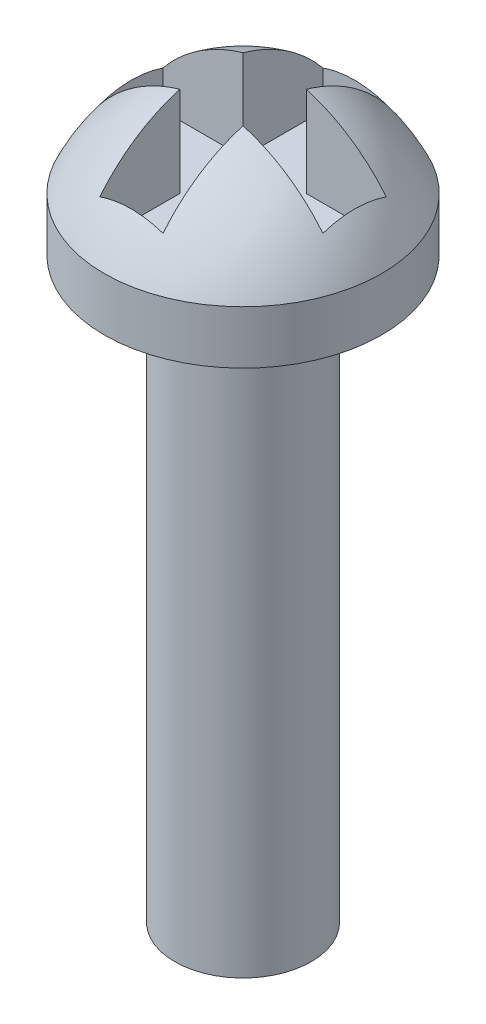
ISO-10303-21;
HEADER;
FILE_DESCRIPTION(('STEP AP214'),'2;1');
FILE_NAME('part.step','',(''),(''),'','','');
FILE_SCHEMA(('AUTOMOTIVE_DESIGN { 1 0 10303 214 1 1 1 1 }'));
ENDSEC;
DATA;
#1=APPLICATION_CONTEXT('core data for automotive mechanical design processes');
#2=APPLICATION_PROTOCOL_DEFINITION('international standard','automotive_design',2000,#1);
#3=PRODUCT_CONTEXT('',#1,'mechanical');
#4=PRODUCT('Part','Part','',(#3));
#5=PRODUCT_RELATED_PRODUCT_CATEGORY('part','',(#4));
#6=PRODUCT_DEFINITION_FORMATION('','',#4);
#7=PRODUCT_DEFINITION_CONTEXT('part definition',#1,'design');
#8=PRODUCT_DEFINITION('design','',#6,#7);
#9=PRODUCT_DEFINITION_SHAPE('','',#8);
#10=(LENGTH_UNIT() NAMED_UNIT(*) SI_UNIT(.MILLI.,.METRE.));
#11=(NAMED_UNIT(*) PLANE_ANGLE_UNIT() SI_UNIT($,.RADIAN.));
#12=(NAMED_UNIT(*) SI_UNIT($,.STERADIAN.) SOLID_ANGLE_UNIT());
#13=UNCERTAINTY_MEASURE_WITH_UNIT(LENGTH_MEASURE(1.E-05),#10,'distance_accuracy_value','');
#14=(GEOMETRIC_REPRESENTATION_CONTEXT(3) GLOBAL_UNCERTAINTY_ASSIGNED_CONTEXT((#13)) GLOBAL_UNIT_ASSIGNED_CONTEXT((#10,
#11,#12)) REPRESENTATION_CONTEXT('',''));
#15=CARTESIAN_POINT('',(0.,0.,0.));
#16=DIRECTION('',(0.,0.,1.));
#17=DIRECTION('',(1.,0.,0.));
#18=AXIS2_PLACEMENT_3D('',#15,#16,#17);
#19=CARTESIAN_POINT('',(1.5,0.,0.));
#20=DIRECTION('',(0.,1.,0.));
#21=DIRECTION('',(0.,0.,1.));
#22=AXIS2_PLACEMENT_3D('',#19,#20,#21);
#23=PLANE('',#22);
#24=CARTESIAN_POINT('',(0.,0.,0.));
#25=DIRECTION('',(0.,1.,0.));
#26=DIRECTION('',(0.,0.,1.));
#27=AXIS2_PLACEMENT_3D('',#24,#25,#26);
#28=CIRCLE('',#27,1.5);
#29=CARTESIAN_POINT('',(0.,0.,1.5));
#30=VERTEX_POINT('',#29);
#31=EDGE_CURVE('E12',#30,#30,#28,.T.);
#32=ORIENTED_EDGE('',*,*,#31,.F.);
#33=EDGE_LOOP('',(#32));
#34=FACE_BOUND('',#33,.T.);
#35=ADVANCED_FACE('F57',(#34),#23,.F.);
#36=CARTESIAN_POINT('',(0.,18.8811759560963,0.));
#37=DIRECTION('',(0.,1.,0.));
#38=DIRECTION('',(0.,0.,1.));
#39=AXIS2_PLACEMENT_3D('',#36,#37,#38);
#40=CYLINDRICAL_SURFACE('',#39,1.5);
#41=CARTESIAN_POINT('',(0.,12.7,0.));
#42=DIRECTION('',(0.,1.,0.));
#43=DIRECTION('',(0.,0.,1.));
#44=AXIS2_PLACEMENT_3D('',#41,#42,#43);
#45=CIRCLE('',#44,1.5);
#46=CARTESIAN_POINT('',(0.,12.7,1.5));
#47=VERTEX_POINT('',#46);
#48=EDGE_CURVE('E64',#47,#47,#45,.T.);
#49=ORIENTED_EDGE('',*,*,#48,.F.);
#50=EDGE_LOOP('',(#49));
#51=FACE_BOUND('',#50,.T.);
#52=ORIENTED_EDGE('',*,*,#31,.T.);
#53=EDGE_LOOP('',(#52));
#54=FACE_BOUND('',#53,.T.);
#55=ADVANCED_FACE('F264',(#51,#54),#40,.T.);
#56=CARTESIAN_POINT('',(3.048,12.7,0.));
#57=DIRECTION('',(0.,1.,0.));
#58=DIRECTION('',(0.,0.,1.));
#59=AXIS2_PLACEMENT_3D('',#56,#57,#58);
#60=PLANE('',#59);
#61=CARTESIAN_POINT('',(0.,12.7,0.));
#62=DIRECTION('',(0.,1.,0.));
#63=DIRECTION('',(0.,0.,1.));
#64=AXIS2_PLACEMENT_3D('',#61,#62,#63);
#65=CIRCLE('',#64,3.048);
#66=CARTESIAN_POINT('',(0.,12.7,3.048));
#67=VERTEX_POINT('',#66);
#68=EDGE_CURVE('E303',#67,#67,#65,.T.);
#69=ORIENTED_EDGE('',*,*,#68,.F.);
#70=EDGE_LOOP('',(#69));
#71=FACE_BOUND('',#70,.T.);
#72=ORIENTED_EDGE('',*,*,#48,.T.);
#73=EDGE_LOOP('',(#72));
#74=FACE_BOUND('',#73,.T.);
#75=ADVANCED_FACE('F269',(#71,#74),#60,.F.);
#76=CARTESIAN_POINT('',(0.,18.8811759560963,0.));
#77=DIRECTION('',(0.,1.,0.));
#78=DIRECTION('',(0.,0.,1.));
#79=AXIS2_PLACEMENT_3D('',#76,#77,#78);
#80=CYLINDRICAL_SURFACE('',#79,3.048);
#81=CARTESIAN_POINT('',(0.,13.8684,0.));
#82=DIRECTION('',(0.,1.,0.));
#83=DIRECTION('',(0.,0.,1.));
#84=AXIS2_PLACEMENT_3D('',#81,#82,#83);
#85=CIRCLE('',#84,3.048);
#86=CARTESIAN_POINT('',(0.,13.8684,3.048));
#87=VERTEX_POINT('',#86);
#88=EDGE_CURVE('E297',#87,#87,#85,.T.);
#89=ORIENTED_EDGE('',*,*,#88,.F.);
#90=EDGE_LOOP('',(#89));
#91=FACE_BOUND('',#90,.T.);
#92=ORIENTED_EDGE('',*,*,#68,.T.);
#93=EDGE_LOOP('',(#92));
#94=FACE_BOUND('',#93,.T.);
#95=ADVANCED_FACE('F276',(#91,#94),#80,.T.);
#96=CARTESIAN_POINT('',(3.048,13.8684,0.));
#97=CARTESIAN_POINT('',(2.15811500529661,15.7488858949441,0.));
#98=CARTESIAN_POINT('',(0.,16.1284431348747,0.));
#99=B_SPLINE_CURVE_WITH_KNOTS('',2,(#96,#97,#98),.UNSPECIFIED.,.F.,.F.,(3,3),(0.,1.),.UNSPECIFIED.);
#100=CARTESIAN_POINT('',(0.,18.8811759560963,0.));
#101=DIRECTION('',(0.,1.,0.));
#102=AXIS1_PLACEMENT('',#100,#101);
#103=SURFACE_OF_REVOLUTION('',#99,#102);
#104=CARTESIAN_POINT('',(2.45218728764485,14.683308631759,0.695108309230363));
#105=CARTESIAN_POINT('',(2.41786052376193,14.7253872350512,0.695108309230363));
#106=CARTESIAN_POINT('',(2.38262641191071,14.7667185759453,0.695108309230363));
#107=CARTESIAN_POINT('',(2.31036374108099,14.8477868572137,0.695108309230363));
#108=CARTESIAN_POINT('',(2.27333504315454,14.8875236736932,0.695108309230363));
#109=CARTESIAN_POINT('',(2.15965442847867,15.0041225825388,0.695108309230363));
#110=CARTESIAN_POINT('',(2.08035469381299,15.0784386948007,0.695108309230364));
#111=CARTESIAN_POINT('',(1.92272166097997,15.2130443459372,0.695108309230364));
#112=CARTESIAN_POINT('',(1.84495130613577,15.2739946613887,0.695108309230363));
#113=CARTESIAN_POINT('',(1.68454791536524,15.3891257344794,0.695108309230363));
#114=CARTESIAN_POINT('',(1.60191298657669,15.4433038310147,0.695108309230363));
#115=CARTESIAN_POINT('',(1.34700620449468,15.5955328741599,0.695108309230363));
#116=CARTESIAN_POINT('',(1.16811839099057,15.6829498663756,0.695108309230363));
#117=CARTESIAN_POINT('',(0.914443673240731,15.7812736383855,0.695108309230363));
#118=CARTESIAN_POINT('',(0.844635576474757,15.8058070574795,0.695108309230363));
#119=CARTESIAN_POINT('',(0.703487643680039,15.8501494624063,0.695108309230363));
#120=CARTESIAN_POINT('',(0.632147575715065,15.8699577272882,0.695108309230363));
#121=CARTESIAN_POINT('',(0.488626573008984,15.9040886720148,0.695108309230363));
#122=CARTESIAN_POINT('',(0.416453692338183,15.9184448990654,0.695108309230363));
#123=CARTESIAN_POINT('',(0.271143140289398,15.9407909402673,0.695108309230363));
#124=CARTESIAN_POINT('',(0.198006156143088,15.9487850638103,0.695108309230364));
#125=CARTESIAN_POINT('',(0.050509216789308,15.9573334259051,0.695108309230364));
#126=CARTESIAN_POINT('',(-0.0238555414520178,15.957809288695,0.695108309230363));
#127=CARTESIAN_POINT('',(-0.17224174189976,15.9510278677989,0.695108309230363));
#128=CARTESIAN_POINT('',(-0.246263028007006,15.9437673592095,0.695108309230363));
#129=CARTESIAN_POINT('',(-0.39371934539479,15.9225599834415,0.695108309230363));
#130=CARTESIAN_POINT('',(-0.467148942209125,15.90857669825,0.695108309230363));
#131=CARTESIAN_POINT('',(-0.612724200966694,15.8750451691733,0.695108309230363));
#132=CARTESIAN_POINT('',(-0.684869456442954,15.8554951956833,0.695108309230364));
#133=CARTESIAN_POINT('',(-0.849941963410784,15.8046713863783,0.695108309230364));
#134=CARTESIAN_POINT('',(-0.942330410714092,15.7716427757686,0.695108309230363));
#135=CARTESIAN_POINT('',(-1.124070512989,15.6979589344262,0.695108309230363));
#136=CARTESIAN_POINT('',(-1.21342005801931,15.6572985275852,0.695108309230364));
#137=CARTESIAN_POINT('',(-1.38829820933419,15.5687863117945,0.695108309230363));
#138=CARTESIAN_POINT('',(-1.47383292154491,15.5209465721158,0.695108309230362));
#139=CARTESIAN_POINT('',(-1.64057279606797,15.4183387642174,0.695108309230364));
#140=CARTESIAN_POINT('',(-1.72178071860754,15.36357519006,0.695108309230367));
#141=CARTESIAN_POINT('',(-1.86120032778571,15.2608208953479,0.695108309230367));
#142=CARTESIAN_POINT('',(-1.92040498954953,15.2141697450536,0.695108309230364));
#143=CARTESIAN_POINT('',(-2.03570132244963,15.1171714554108,0.695108309230362));
#144=CARTESIAN_POINT('',(-2.09179322938465,15.0668245966941,0.695108309230363));
#145=CARTESIAN_POINT('',(-2.20059785351121,14.9627575389312,0.695108309230364));
#146=CARTESIAN_POINT('',(-2.25331523629739,14.9090422099825,0.695108309230364));
#147=CARTESIAN_POINT('',(-2.35533883832368,14.7984639716167,0.695108309230363));
#148=CARTESIAN_POINT('',(-2.40464509816146,14.7416010996747,0.695108309230363));
#149=CARTESIAN_POINT('',(-2.45218728764478,14.6833086317591,0.695108309230363));
#150=B_SPLINE_CURVE_WITH_KNOTS('',3,(#104,#105,#106,#107,#108,#109,#110,#111,#112,#113,#114,
#115,#116,#117,#118,#119,#120,#121,#122,#123,#124,#125,#126,#127,#128,#129,#130,#131,#132,#133,
#134,#135,#136,#137,#138,#139,#140,#141,#142,#143,#144,#145,#146,#147,#148,#149),.UNSPECIFIED.,
.F.,.F.,(4,2,2,2,2,2,2,2,2,2,2,2,2,2,2,2,2,2,2,2,2,2,4),(0.,0.162887365782872,0.325787363522561,
0.651334802267644,0.947397805339321,1.2435767813607,1.83743811303774,2.05932370653175,
2.28124313309363,2.50177403544007,2.72215543301401,2.9448327466095,3.16760291948517,
3.39159369770457,3.61565414734007,3.90962034044839,4.20378663526021,4.49746383108754,
4.79095137875579,5.01693147633827,5.24289443194569,5.4685379060844,5.69417869425192),.UNSPECIFIED.);
#151=CARTESIAN_POINT('',(-0.695108309230364,15.8516865527996,0.695108309230363));
#152=VERTEX_POINT('',#151);
#153=CARTESIAN_POINT('',(-2.45218728764485,14.6833086317591,0.695108309230363));
#154=VERTEX_POINT('',#153);
#155=EDGE_CURVE('E239',#152,#154,#150,.T.);
#156=ORIENTED_EDGE('',*,*,#155,.T.);
#157=CARTESIAN_POINT('',(-2.45218728764481,14.6833086317591,-0.695108309230353));
#158=CARTESIAN_POINT('',(-2.45218728764483,14.7013143410647,-0.643309765145707));
#159=CARTESIAN_POINT('',(-2.45218728764484,14.7173537277317,-0.590824345734146));
#160=CARTESIAN_POINT('',(-2.45218728764485,14.7453668382591,-0.48477111569305));
#161=CARTESIAN_POINT('',(-2.45218728764485,14.757339902842,-0.431203131036202));
#162=CARTESIAN_POINT('',(-2.45218728764485,14.7770902809719,-0.323244721441193));
#163=CARTESIAN_POINT('',(-2.45218728764485,14.7848638217974,-0.268853601961661));
#164=CARTESIAN_POINT('',(-2.45218728764484,14.7961183975468,-0.159645589862251));
#165=CARTESIAN_POINT('',(-2.45218728764484,14.7995998864219,-0.104828742886904));
#166=CARTESIAN_POINT('',(-2.45218728764487,14.8035326540557,0.059890129572541));
#167=CARTESIAN_POINT('',(-2.45218728764498,14.7974634257665,0.17001237939108));
#168=CARTESIAN_POINT('',(-2.45218728764471,14.7681739781714,0.387716872042851));
#169=CARTESIAN_POINT('',(-2.45218728764434,14.7449915926198,0.495304178537056));
#170=CARTESIAN_POINT('',(-2.45218728764479,14.7090937619302,0.616273177101096));
#171=CARTESIAN_POINT('',(-2.45218728764487,14.7041877957881,0.632129179410969));
#172=CARTESIAN_POINT('',(-2.45218728764482,14.6940169455485,0.663712368626811));
#173=CARTESIAN_POINT('',(-2.4521872876447,14.6887523369885,0.679439644252939));
#174=CARTESIAN_POINT('',(-2.45218728764436,14.6833086317592,0.695108309230538));
#175=B_SPLINE_CURVE_WITH_KNOTS('',3,(#157,#158,#159,#160,#161,#162,#163,#164,#165,#166,#167,
#168,#169,#170,#171,#172,#173,#174),.UNSPECIFIED.,.F.,.F.,(4,2,2,2,2,2,2,2,4),(0.,
0.16448136238942,0.328989379615555,0.49364494099215,0.658283085990713,0.987704444519377,
1.31639969148478,1.36619170176598,1.41594588016233),.UNSPECIFIED.);
#176=CARTESIAN_POINT('',(-2.45218728764481,14.6833086317591,-0.695108309230353));
#177=VERTEX_POINT('',#176);
#178=EDGE_CURVE('E186',#177,#154,#175,.T.);
#179=ORIENTED_EDGE('',*,*,#178,.F.);
#180=CARTESIAN_POINT('',(2.45218728764485,14.683308631759,-0.695108309230363));
#181=CARTESIAN_POINT('',(2.41786052376193,14.7253872350512,-0.695108309230363));
#182=CARTESIAN_POINT('',(2.38262641191071,14.7667185759453,-0.695108309230363));
#183=CARTESIAN_POINT('',(2.31036374108099,14.8477868572137,-0.695108309230363));
#184=CARTESIAN_POINT('',(2.27333504315454,14.8875236736932,-0.695108309230363));
#185=CARTESIAN_POINT('',(2.15965442847867,15.0041225825388,-0.695108309230363));
#186=CARTESIAN_POINT('',(2.08035469381299,15.0784386948007,-0.695108309230363));
#187=CARTESIAN_POINT('',(1.92272166097997,15.2130443459372,-0.695108309230363));
#188=CARTESIAN_POINT('',(1.84495130613577,15.2739946613887,-0.695108309230363));
#189=CARTESIAN_POINT('',(1.68454791536524,15.3891257344794,-0.695108309230363));
#190=CARTESIAN_POINT('',(1.60191298657669,15.4433038310147,-0.695108309230363));
#191=CARTESIAN_POINT('',(1.34700620449468,15.5955328741599,-0.695108309230363));
#192=CARTESIAN_POINT('',(1.16811839099058,15.6829498663756,-0.695108309230363));
#193=CARTESIAN_POINT('',(0.914443673240733,15.7812736383855,-0.695108309230363));
#194=CARTESIAN_POINT('',(0.844635576474759,15.8058070574795,-0.695108309230363));
#195=CARTESIAN_POINT('',(0.703487643680042,15.8501494624063,-0.695108309230363));
#196=CARTESIAN_POINT('',(0.632147575715067,15.8699577272882,-0.695108309230363));
#197=CARTESIAN_POINT('',(0.488626573008986,15.9040886720148,-0.695108309230363));
#198=CARTESIAN_POINT('',(0.416453692338184,15.9184448990654,-0.695108309230363));
#199=CARTESIAN_POINT('',(0.271143140289399,15.9407909402673,-0.695108309230363));
#200=CARTESIAN_POINT('',(0.198006156143089,15.9487850638103,-0.695108309230363));
#201=CARTESIAN_POINT('',(0.0505092167893075,15.9573334259051,-0.695108309230363));
#202=CARTESIAN_POINT('',(-0.0238555414520186,15.957809288695,-0.695108309230363));
#203=CARTESIAN_POINT('',(-0.172241741899762,15.9510278677989,-0.695108309230363));
#204=CARTESIAN_POINT('',(-0.246263028007008,15.9437673592095,-0.695108309230363));
#205=CARTESIAN_POINT('',(-0.393719345394793,15.9225599834415,-0.695108309230363));
#206=CARTESIAN_POINT('',(-0.467148942209129,15.90857669825,-0.695108309230363));
#207=CARTESIAN_POINT('',(-0.6127242009667,15.8750451691733,-0.695108309230363));
#208=CARTESIAN_POINT('',(-0.684869456442959,15.8554951956833,-0.695108309230363));
#209=CARTESIAN_POINT('',(-0.849941963410789,15.8046713863783,-0.695108309230363));
#210=CARTESIAN_POINT('',(-0.942330410714097,15.7716427757686,-0.695108309230363));
#211=CARTESIAN_POINT('',(-1.124070512989,15.6979589344262,-0.695108309230364));
#212=CARTESIAN_POINT('',(-1.21342005801931,15.6572985275852,-0.695108309230364));
#213=CARTESIAN_POINT('',(-1.3882982093342,15.5687863117945,-0.695108309230363));
#214=CARTESIAN_POINT('',(-1.47383292154492,15.5209465721158,-0.695108309230362));
#215=CARTESIAN_POINT('',(-1.64057279606797,15.4183387642174,-0.695108309230365));
#216=CARTESIAN_POINT('',(-1.72178071860755,15.36357519006,-0.695108309230368));
#217=CARTESIAN_POINT('',(-1.86120032778571,15.2608208953479,-0.695108309230367));
#218=CARTESIAN_POINT('',(-1.92040498954954,15.2141697450536,-0.695108309230364));
#219=CARTESIAN_POINT('',(-2.03570132244964,15.1171714554108,-0.695108309230362));
#220=CARTESIAN_POINT('',(-2.09179322938465,15.0668245966941,-0.695108309230363));
#221=CARTESIAN_POINT('',(-2.20059785351121,14.9627575389312,-0.695108309230364));
#222=CARTESIAN_POINT('',(-2.2533152362974,14.9090422099825,-0.695108309230363));
#223=CARTESIAN_POINT('',(-2.35533883832368,14.7984639716167,-0.695108309230363));
#224=CARTESIAN_POINT('',(-2.40464509816146,14.7416010996747,-0.695108309230363));
#225=CARTESIAN_POINT('',(-2.45218728764478,14.6833086317591,-0.695108309230364));
#226=B_SPLINE_CURVE_WITH_KNOTS('',3,(#180,#181,#182,#183,#184,#185,#186,#187,#188,#189,#190,
#191,#192,#193,#194,#195,#196,#197,#198,#199,#200,#201,#202,#203,#204,#205,#206,#207,#208,#209,
#210,#211,#212,#213,#214,#215,#216,#217,#218,#219,#220,#221,#222,#223,#224,#225),.UNSPECIFIED.,
.F.,.F.,(4,2,2,2,2,2,2,2,2,2,2,2,2,2,2,2,2,2,2,2,2,2,4),(0.,0.162887365782872,0.325787363522561,
0.651334802267644,0.947397805339321,1.2435767813607,1.83743811303774,2.05932370653174,
2.28124313309363,2.50177403544007,2.72215543301401,2.9448327466095,3.16760291948517,
3.39159369770458,3.61565414734008,3.9096203404484,4.20378663526022,4.49746383108755,
4.7909513787558,5.01693147633828,5.2428944319457,5.4685379060844,5.69417869425192),.UNSPECIFIED.);
#227=CARTESIAN_POINT('',(-0.695108309230363,15.8516865527996,-0.695108309230364));
#228=VERTEX_POINT('',#227);
#229=EDGE_CURVE('E119',#228,#177,#226,.T.);
#230=ORIENTED_EDGE('',*,*,#229,.F.);
#231=CARTESIAN_POINT('',(-0.695108309230364,14.683308631759,-2.45218728764485));
#232=CARTESIAN_POINT('',(-0.695108309230363,14.7253872350512,-2.41786052376193));
#233=CARTESIAN_POINT('',(-0.695108309230363,14.7667185759453,-2.38262641191072));
#234=CARTESIAN_POINT('',(-0.695108309230364,14.8477868572137,-2.31036374108099));
#235=CARTESIAN_POINT('',(-0.695108309230364,14.8875236736932,-2.27333504315455));
#236=CARTESIAN_POINT('',(-0.695108309230363,15.0041225825388,-2.15965442847868));
#237=CARTESIAN_POINT('',(-0.695108309230362,15.0784386948007,-2.08035469381299));
#238=CARTESIAN_POINT('',(-0.695108309230362,15.2130443459372,-1.92272166097997));
#239=CARTESIAN_POINT('',(-0.695108309230363,15.2739946613887,-1.84495130613578));
#240=CARTESIAN_POINT('',(-0.695108309230364,15.3891257344794,-1.68454791536525));
#241=CARTESIAN_POINT('',(-0.695108309230364,15.4433038310146,-1.6019129865767));
#242=CARTESIAN_POINT('',(-0.695108309230363,15.5955328741598,-1.3470062044947));
#243=CARTESIAN_POINT('',(-0.695108309230364,15.6829498663756,-1.16811839099059));
#244=CARTESIAN_POINT('',(-0.695108309230364,15.7812736383855,-0.914443673240746));
#245=CARTESIAN_POINT('',(-0.695108309230364,15.8058070574795,-0.844635576474772));
#246=CARTESIAN_POINT('',(-0.695108309230364,15.8501494624063,-0.703487643680053));
#247=CARTESIAN_POINT('',(-0.695108309230364,15.8699577272882,-0.632147575715078));
#248=CARTESIAN_POINT('',(-0.695108309230364,15.9040886720148,-0.488626573008995));
#249=CARTESIAN_POINT('',(-0.695108309230364,15.9184448990654,-0.416453692338194));
#250=CARTESIAN_POINT('',(-0.695108309230363,15.9407909402673,-0.271143140289407));
#251=CARTESIAN_POINT('',(-0.695108309230363,15.9487850638103,-0.198006156143096));
#252=CARTESIAN_POINT('',(-0.695108309230363,15.9573334259051,-0.0505092167893136));
#253=CARTESIAN_POINT('',(-0.695108309230364,15.957809288695,0.023855541452013));
#254=CARTESIAN_POINT('',(-0.695108309230364,15.9510278677989,0.172241741899757));
#255=CARTESIAN_POINT('',(-0.695108309230364,15.9437673592095,0.246263028007005));
#256=CARTESIAN_POINT('',(-0.695108309230364,15.9225599834415,0.393719345394791));
#257=CARTESIAN_POINT('',(-0.695108309230364,15.90857669825,0.467148942209127));
#258=CARTESIAN_POINT('',(-0.695108309230363,15.8750451691733,0.612724200966699));
#259=CARTESIAN_POINT('',(-0.695108309230363,15.8554951956833,0.684869456442959));
#260=CARTESIAN_POINT('',(-0.695108309230363,15.8046713863783,0.84994196341079));
#261=CARTESIAN_POINT('',(-0.695108309230363,15.7716427757686,0.942330410714098));
#262=CARTESIAN_POINT('',(-0.695108309230364,15.6979589344262,1.12407051298901));
#263=CARTESIAN_POINT('',(-0.695108309230364,15.6572985275852,1.21342005801931));
#264=CARTESIAN_POINT('',(-0.695108309230363,15.5687863117945,1.3882982093342));
#265=CARTESIAN_POINT('',(-0.695108309230362,15.5209465721158,1.47383292154492));
#266=CARTESIAN_POINT('',(-0.695108309230365,15.4183387642174,1.64057279606798));
#267=CARTESIAN_POINT('',(-0.695108309230369,15.36357519006,1.72178071860755));
#268=CARTESIAN_POINT('',(-0.695108309230368,15.2608208953478,1.86120032778572));
#269=CARTESIAN_POINT('',(-0.695108309230365,15.2141697450536,1.92040498954956));
#270=CARTESIAN_POINT('',(-0.695108309230362,15.1171714554108,2.03570132244966));
#271=CARTESIAN_POINT('',(-0.695108309230363,15.0668245966941,2.09179322938468));
#272=CARTESIAN_POINT('',(-0.695108309230364,14.9627575389312,2.20059785351125));
#273=CARTESIAN_POINT('',(-0.695108309230364,14.9090422099825,2.25331523629744));
#274=CARTESIAN_POINT('',(-0.695108309230364,14.7984639716166,2.35533883832374));
#275=CARTESIAN_POINT('',(-0.695108309230364,14.7416010996747,2.40464509816152));
#276=CARTESIAN_POINT('',(-0.695108309230365,14.683308631759,2.45218728764485));
#277=B_SPLINE_CURVE_WITH_KNOTS('',3,(#231,#232,#233,#234,#235,#236,#237,#238,#239,#240,#241,
#242,#243,#244,#245,#246,#247,#248,#249,#250,#251,#252,#253,#254,#255,#256,#257,#258,#259,#260,
#261,#262,#263,#264,#265,#266,#267,#268,#269,#270,#271,#272,#273,#274,#275,#276),.UNSPECIFIED.,
.F.,.F.,(4,2,2,2,2,2,2,2,2,2,2,2,2,2,2,2,2,2,2,2,2,2,4),(0.,0.162887365782873,0.32578736352256,
0.651334802267643,0.947397805339317,1.24357678136069,1.83743811303773,2.05932370653174,
2.28124313309362,2.50177403544007,2.72215543301401,2.9448327466095,3.16760291948518,
3.39159369770458,3.61565414734008,3.9096203404484,4.20378663526022,4.49746383108756,
4.79095137875581,5.01693147633831,5.24289443194576,5.46853790608448,5.69417869425202),.UNSPECIFIED.);
#278=CARTESIAN_POINT('',(-0.695108309230364,14.683308631759,-2.45218728764485));
#279=VERTEX_POINT('',#278);
#280=EDGE_CURVE('E240',#279,#228,#277,.T.);
#281=ORIENTED_EDGE('',*,*,#280,.F.);
#282=CARTESIAN_POINT('',(0.695108309230364,14.683308631759,-2.45218728764485));
#283=CARTESIAN_POINT('',(0.643309765145734,14.7013143410646,-2.45218728764485));
#284=CARTESIAN_POINT('',(0.59082434573418,14.7173537277316,-2.45218728764485));
#285=CARTESIAN_POINT('',(0.484771115693088,14.7453668382591,-2.45218728764485));
#286=CARTESIAN_POINT('',(0.431203131036239,14.757339902842,-2.45218728764485));
#287=CARTESIAN_POINT('',(0.32324472144123,14.7770902809719,-2.45218728764485));
#288=CARTESIAN_POINT('',(0.268853601961699,14.7848638217974,-2.45218728764485));
#289=CARTESIAN_POINT('',(0.159645589862292,14.7961183975468,-2.45218728764484));
#290=CARTESIAN_POINT('',(0.104828742886947,14.7995998864219,-2.45218728764483));
#291=CARTESIAN_POINT('',(-0.0598901295724979,14.8035326540557,-2.45218728764487));
#292=CARTESIAN_POINT('',(-0.170012379391038,14.7974634257665,-2.45218728764498));
#293=CARTESIAN_POINT('',(-0.387716872042809,14.7681739781714,-2.45218728764471));
#294=CARTESIAN_POINT('',(-0.495304178537014,14.7449915926198,-2.45218728764434));
#295=CARTESIAN_POINT('',(-0.616273177101072,14.7090937619302,-2.45218728764479));
#296=CARTESIAN_POINT('',(-0.632129179410959,14.7041877957881,-2.45218728764487));
#297=CARTESIAN_POINT('',(-0.663712368626827,14.6940169455485,-2.45218728764482));
#298=CARTESIAN_POINT('',(-0.679439644252967,14.6887523369885,-2.4521872876447));
#299=CARTESIAN_POINT('',(-0.695108309230578,14.6833086317592,-2.45218728764436));
#300=B_SPLINE_CURVE_WITH_KNOTS('',3,(#282,#283,#284,#285,#286,#287,#288,#289,#290,#291,#292,
#293,#294,#295,#296,#297,#298,#299),.UNSPECIFIED.,.F.,.F.,(4,2,2,2,2,2,2,2,4),(0.,
0.164481362389426,0.328989379615563,0.493644940992153,0.658283085990713,0.987704444519377,
1.31639969148478,1.36619170176602,1.41594588016242),.UNSPECIFIED.);
#301=CARTESIAN_POINT('',(0.695108309230364,14.683308631759,-2.45218728764485));
#302=VERTEX_POINT('',#301);
#303=EDGE_CURVE('E210',#302,#279,#300,.T.);
#304=ORIENTED_EDGE('',*,*,#303,.F.);
#305=CARTESIAN_POINT('',(0.695108309230364,14.683308631759,-2.45218728764485));
#306=CARTESIAN_POINT('',(0.695108309230364,14.7253872350512,-2.41786052376193));
#307=CARTESIAN_POINT('',(0.695108309230364,14.7667185759453,-2.38262641191072));
#308=CARTESIAN_POINT('',(0.695108309230364,14.8477868572137,-2.31036374108099));
#309=CARTESIAN_POINT('',(0.695108309230364,14.8875236736932,-2.27333504315455));
#310=CARTESIAN_POINT('',(0.695108309230364,15.0041225825388,-2.15965442847868));
#311=CARTESIAN_POINT('',(0.695108309230364,15.0784386948007,-2.08035469381299));
#312=CARTESIAN_POINT('',(0.695108309230364,15.2130443459372,-1.92272166097998));
#313=CARTESIAN_POINT('',(0.695108309230364,15.2739946613887,-1.84495130613578));
#314=CARTESIAN_POINT('',(0.695108309230364,15.3891257344794,-1.68454791536525));
#315=CARTESIAN_POINT('',(0.695108309230364,15.4433038310146,-1.6019129865767));
#316=CARTESIAN_POINT('',(0.695108309230364,15.5955328741598,-1.34700620449469));
#317=CARTESIAN_POINT('',(0.695108309230364,15.6829498663756,-1.16811839099058));
#318=CARTESIAN_POINT('',(0.695108309230364,15.7812736383855,-0.914443673240738));
#319=CARTESIAN_POINT('',(0.695108309230364,15.8058070574795,-0.844635576474765));
#320=CARTESIAN_POINT('',(0.695108309230364,15.8501494624063,-0.703487643680047));
#321=CARTESIAN_POINT('',(0.695108309230364,15.8699577272882,-0.632147575715071));
#322=CARTESIAN_POINT('',(0.695108309230364,15.9040886720148,-0.48862657300899));
#323=CARTESIAN_POINT('',(0.695108309230364,15.9184448990654,-0.416453692338188));
#324=CARTESIAN_POINT('',(0.695108309230364,15.9407909402673,-0.271143140289402));
#325=CARTESIAN_POINT('',(0.695108309230363,15.9487850638103,-0.198006156143091));
#326=CARTESIAN_POINT('',(0.695108309230363,15.9573334259052,-0.0505092167893096));
#327=CARTESIAN_POINT('',(0.695108309230364,15.957809288695,0.0238555414520166));
#328=CARTESIAN_POINT('',(0.695108309230364,15.9510278677989,0.17224174189976));
#329=CARTESIAN_POINT('',(0.695108309230364,15.9437673592095,0.246263028007007));
#330=CARTESIAN_POINT('',(0.695108309230364,15.9225599834415,0.393719345394792));
#331=CARTESIAN_POINT('',(0.695108309230364,15.90857669825,0.467148942209128));
#332=CARTESIAN_POINT('',(0.695108309230364,15.8750451691733,0.612724200966699));
#333=CARTESIAN_POINT('',(0.695108309230363,15.8554951956833,0.684869456442959));
#334=CARTESIAN_POINT('',(0.695108309230363,15.8046713863783,0.849941963410789));
#335=CARTESIAN_POINT('',(0.695108309230363,15.7716427757686,0.942330410714097));
#336=CARTESIAN_POINT('',(0.695108309230364,15.6979589344262,1.124070512989));
#337=CARTESIAN_POINT('',(0.695108309230364,15.6572985275852,1.21342005801931));
#338=CARTESIAN_POINT('',(0.695108309230363,15.5687863117945,1.3882982093342));
#339=CARTESIAN_POINT('',(0.695108309230362,15.5209465721158,1.47383292154492));
#340=CARTESIAN_POINT('',(0.695108309230365,15.4183387642174,1.64057279606797));
#341=CARTESIAN_POINT('',(0.695108309230369,15.36357519006,1.72178071860755));
#342=CARTESIAN_POINT('',(0.695108309230368,15.2608208953478,1.86120032778572));
#343=CARTESIAN_POINT('',(0.695108309230365,15.2141697450536,1.92040498954955));
#344=CARTESIAN_POINT('',(0.695108309230363,15.1171714554108,2.03570132244966));
#345=CARTESIAN_POINT('',(0.695108309230363,15.0668245966941,2.09179322938468));
#346=CARTESIAN_POINT('',(0.695108309230364,14.9627575389312,2.20059785351125));
#347=CARTESIAN_POINT('',(0.695108309230364,14.9090422099825,2.25331523629744));
#348=CARTESIAN_POINT('',(0.695108309230363,14.7984639716166,2.35533883832374));
#349=CARTESIAN_POINT('',(0.695108309230363,14.7416010996747,2.40464509816152));
#350=CARTESIAN_POINT('',(0.695108309230362,14.683308631759,2.45218728764485));
#351=B_SPLINE_CURVE_WITH_KNOTS('',3,(#305,#306,#307,#308,#309,#310,#311,#312,#313,#314,#315,
#316,#317,#318,#319,#320,#321,#322,#323,#324,#325,#326,#327,#328,#329,#330,#331,#332,#333,#334,
#335,#336,#337,#338,#339,#340,#341,#342,#343,#344,#345,#346,#347,#348,#349,#350),.UNSPECIFIED.,
.F.,.F.,(4,2,2,2,2,2,2,2,2,2,2,2,2,2,2,2,2,2,2,2,2,2,4),(0.,0.162887365782872,0.325787363522559,
0.651334802267642,0.947397805339318,1.2435767813607,1.83743811303774,2.05932370653174,
2.28124313309363,2.50177403544008,2.72215543301401,2.94483274660951,3.16760291948518,
3.39159369770458,3.61565414734008,3.9096203404484,4.20378663526022,4.49746383108755,
4.79095137875581,5.01693147633831,5.24289443194576,5.46853790608448,5.69417869425202),.UNSPECIFIED.);
#352=CARTESIAN_POINT('',(0.695108309230302,15.8516865527996,-0.695108309230353));
#353=VERTEX_POINT('',#352);
#354=EDGE_CURVE('E339',#302,#353,#351,.T.);
#355=ORIENTED_EDGE('',*,*,#354,.T.);
#356=CARTESIAN_POINT('',(2.45218728764485,14.683308631759,-0.695108309230363));
#357=VERTEX_POINT('',#356);
#358=EDGE_CURVE('E163',#357,#353,#226,.T.);
#359=ORIENTED_EDGE('',*,*,#358,.F.);
#360=CARTESIAN_POINT('',(2.45218728764485,14.683308631759,-0.695108309230363));
#361=CARTESIAN_POINT('',(2.45218728764485,14.7013143410646,-0.643309765145732));
#362=CARTESIAN_POINT('',(2.45218728764485,14.7173537277316,-0.590824345734177));
#363=CARTESIAN_POINT('',(2.45218728764485,14.7453668382591,-0.484771115693085));
#364=CARTESIAN_POINT('',(2.45218728764485,14.757339902842,-0.431203131036236));
#365=CARTESIAN_POINT('',(2.45218728764485,14.7770902809719,-0.323244721441227));
#366=CARTESIAN_POINT('',(2.45218728764485,14.7848638217974,-0.268853601961696));
#367=CARTESIAN_POINT('',(2.45218728764484,14.7961183975468,-0.159645589862289));
#368=CARTESIAN_POINT('',(2.45218728764483,14.7995998864219,-0.104828742886943));
#369=CARTESIAN_POINT('',(2.45218728764487,14.8035326540557,0.0598901295725024));
#370=CARTESIAN_POINT('',(2.45218728764498,14.7974634257665,0.170012379391042));
#371=CARTESIAN_POINT('',(2.45218728764471,14.7681739781714,0.387716872042814));
#372=CARTESIAN_POINT('',(2.45218728764433,14.7449915926198,0.495304178537019));
#373=CARTESIAN_POINT('',(2.45218728764479,14.7090937619302,0.616273177101075));
#374=CARTESIAN_POINT('',(2.45218728764487,14.7041877957881,0.63212917941096));
#375=CARTESIAN_POINT('',(2.45218728764482,14.6940169455485,0.663712368626826));
#376=CARTESIAN_POINT('',(2.4521872876447,14.6887523369885,0.679439644252965));
#377=CARTESIAN_POINT('',(2.45218728764436,14.6833086317592,0.695108309230575));
#378=B_SPLINE_CURVE_WITH_KNOTS('',3,(#360,#361,#362,#363,#364,#365,#366,#367,#368,#369,#370,
#371,#372,#373,#374,#375,#376,#377),.UNSPECIFIED.,.F.,.F.,(4,2,2,2,2,2,2,2,4),(0.,
0.164481362389426,0.328989379615562,0.493644940992152,0.658283085990714,0.987704444519378,
1.31639969148478,1.36619170176602,1.41594588016241),.UNSPECIFIED.);
#379=CARTESIAN_POINT('',(2.45218728764485,14.683308631759,0.695108309230363));
#380=VERTEX_POINT('',#379);
#381=EDGE_CURVE('E230',#357,#380,#378,.T.);
#382=ORIENTED_EDGE('',*,*,#381,.T.);
#383=CARTESIAN_POINT('',(0.695108309230302,15.8516865527996,0.695108309230353));
#384=VERTEX_POINT('',#383);
#385=EDGE_CURVE('E241',#380,#384,#150,.T.);
#386=ORIENTED_EDGE('',*,*,#385,.T.);
#387=CARTESIAN_POINT('',(0.695108309230363,14.683308631759,2.45218728764485));
#388=VERTEX_POINT('',#387);
#389=EDGE_CURVE('E344',#384,#388,#351,.T.);
#390=ORIENTED_EDGE('',*,*,#389,.T.);
#391=CARTESIAN_POINT('',(0.695108309230363,14.683308631759,2.45218728764485));
#392=CARTESIAN_POINT('',(0.643309765145735,14.7013143410646,2.45218728764485));
#393=CARTESIAN_POINT('',(0.590824345734181,14.7173537277317,2.45218728764485));
#394=CARTESIAN_POINT('',(0.484771115693088,14.7453668382591,2.45218728764485));
#395=CARTESIAN_POINT('',(0.431203131036238,14.757339902842,2.45218728764485));
#396=CARTESIAN_POINT('',(0.323244721441229,14.7770902809719,2.45218728764485));
#397=CARTESIAN_POINT('',(0.268853601961699,14.7848638217974,2.45218728764485));
#398=CARTESIAN_POINT('',(0.159645589862292,14.7961183975468,2.45218728764484));
#399=CARTESIAN_POINT('',(0.104828742886947,14.7995998864219,2.45218728764484));
#400=CARTESIAN_POINT('',(-0.0598901295724984,14.8035326540557,2.45218728764487));
#401=CARTESIAN_POINT('',(-0.170012379391038,14.7974634257665,2.45218728764498));
#402=CARTESIAN_POINT('',(-0.38771687204281,14.7681739781714,2.45218728764471));
#403=CARTESIAN_POINT('',(-0.495304178537016,14.7449915926198,2.45218728764434));
#404=CARTESIAN_POINT('',(-0.616273177101071,14.7090937619302,2.45218728764479));
#405=CARTESIAN_POINT('',(-0.632129179410958,14.7041877957881,2.45218728764487));
#406=CARTESIAN_POINT('',(-0.663712368626826,14.6940169455485,2.45218728764482));
#407=CARTESIAN_POINT('',(-0.679439644252966,14.6887523369885,2.4521872876447));
#408=CARTESIAN_POINT('',(-0.695108309230578,14.6833086317592,2.45218728764436));
#409=B_SPLINE_CURVE_WITH_KNOTS('',3,(#391,#392,#393,#394,#395,#396,#397,#398,#399,#400,#401,
#402,#403,#404,#405,#406,#407,#408),.UNSPECIFIED.,.F.,.F.,(4,2,2,2,2,2,2,2,4),(0.,
0.164481362389425,0.328989379615562,0.493644940992151,0.658283085990712,0.987704444519376,
1.31639969148478,1.36619170176602,1.41594588016242),.UNSPECIFIED.);
#410=CARTESIAN_POINT('',(-0.695108309230364,14.683308631759,2.45218728764485));
#411=VERTEX_POINT('',#410);
#412=EDGE_CURVE('E71',#388,#411,#409,.T.);
#413=ORIENTED_EDGE('',*,*,#412,.T.);
#414=EDGE_CURVE('E325',#152,#411,#277,.T.);
#415=ORIENTED_EDGE('',*,*,#414,.F.);
#416=EDGE_LOOP('',(#156,#179,#230,#281,#304,#355,#359,#382,#386,#390,#413,#415));
#417=FACE_BOUND('',#416,.T.);
#418=ORIENTED_EDGE('',*,*,#88,.T.);
#419=EDGE_LOOP('',(#418));
#420=FACE_BOUND('',#419,.T.);
#421=ADVANCED_FACE('F283',(#417,#420),#103,.T.);
#422=CARTESIAN_POINT('',(-2.45218728764485,16.1294431348747,0.695108309230363));
#423=DIRECTION('',(-1.,0.,0.));
#424=DIRECTION('',(0.,0.,1.));
#425=AXIS2_PLACEMENT_3D('',#422,#423,#424);
#426=PLANE('',#425);
#427=ORIENTED_EDGE('',*,*,#178,.T.);
#428=DIRECTION('',(0.,-1.,0.));
#429=VECTOR('',#428,1.);
#430=CARTESIAN_POINT('',(-2.45218728764485,16.1294431348747,0.695108309230363));
#431=LINE('',#430,#429);
#432=CARTESIAN_POINT('',(-2.45218728764485,13.8684,0.695108309230363));
#433=VERTEX_POINT('',#432);
#434=EDGE_CURVE('E196',#154,#433,#431,.T.);
#435=ORIENTED_EDGE('',*,*,#434,.T.);
#436=DIRECTION('',(0.,0.,-1.));
#437=VECTOR('',#436,1.);
#438=CARTESIAN_POINT('',(-2.45218728764485,13.8684,0.695108309230363));
#439=LINE('',#438,#437);
#440=CARTESIAN_POINT('',(-2.45218728764485,13.8684,-0.695108309230363));
#441=VERTEX_POINT('',#440);
#442=EDGE_CURVE('E182',#433,#441,#439,.T.);
#443=ORIENTED_EDGE('',*,*,#442,.T.);
#444=DIRECTION('',(0.,-1.,0.));
#445=VECTOR('',#444,1.);
#446=CARTESIAN_POINT('',(-2.45218728764485,16.1294431348747,-0.695108309230363));
#447=LINE('',#446,#445);
#448=EDGE_CURVE('E195',#177,#441,#447,.T.);
#449=ORIENTED_EDGE('',*,*,#448,.F.);
#450=EDGE_LOOP('',(#427,#435,#443,#449));
#451=FACE_BOUND('',#450,.T.);
#452=ADVANCED_FACE('F258',(#451),#426,.F.);
#453=CARTESIAN_POINT('',(-2.45218728764485,16.1294431348747,-0.695108309230363));
#454=DIRECTION('',(0.,0.,-1.));
#455=DIRECTION('',(-1.,0.,0.));
#456=AXIS2_PLACEMENT_3D('',#453,#454,#455);
#457=PLANE('',#456);
#458=DIRECTION('',(0.,1.,0.));
#459=VECTOR('',#458,1.);
#460=CARTESIAN_POINT('',(-0.695108309230364,16.1294431348747,-0.695108309230363));
#461=LINE('',#460,#459);
#462=CARTESIAN_POINT('',(-0.695108309230364,13.8684,-0.695108309230363));
#463=VERTEX_POINT('',#462);
#464=EDGE_CURVE('E167',#463,#228,#461,.T.);
#465=ORIENTED_EDGE('',*,*,#464,.T.);
#466=ORIENTED_EDGE('',*,*,#229,.T.);
#467=ORIENTED_EDGE('',*,*,#448,.T.);
#468=DIRECTION('',(1.,0.,0.));
#469=VECTOR('',#468,1.);
#470=CARTESIAN_POINT('',(-2.45218728764485,13.8684,-0.695108309230363));
#471=LINE('',#470,#469);
#472=EDGE_CURVE('E181',#441,#463,#471,.T.);
#473=ORIENTED_EDGE('',*,*,#472,.T.);
#474=EDGE_LOOP('',(#465,#466,#467,#473));
#475=FACE_BOUND('',#474,.T.);
#476=ADVANCED_FACE('F216',(#475),#457,.F.);
#477=CARTESIAN_POINT('',(-2.45218728764485,16.1294431348747,0.695108309230363));
#478=DIRECTION('',(0.,0.,-1.));
#479=DIRECTION('',(-1.,0.,0.));
#480=AXIS2_PLACEMENT_3D('',#477,#478,#479);
#481=PLANE('',#480);
#482=DIRECTION('',(1.,0.,0.));
#483=VECTOR('',#482,1.);
#484=CARTESIAN_POINT('',(-2.45218728764485,13.8684,0.695108309230363));
#485=LINE('',#484,#483);
#486=CARTESIAN_POINT('',(-0.695108309230364,13.8684,0.695108309230363));
#487=VERTEX_POINT('',#486);
#488=EDGE_CURVE('E192',#433,#487,#485,.T.);
#489=ORIENTED_EDGE('',*,*,#488,.F.);
#490=ORIENTED_EDGE('',*,*,#434,.F.);
#491=ORIENTED_EDGE('',*,*,#155,.F.);
#492=DIRECTION('',(0.,1.,0.));
#493=VECTOR('',#492,1.);
#494=CARTESIAN_POINT('',(-0.695108309230364,16.1294431348747,0.695108309230363));
#495=LINE('',#494,#493);
#496=EDGE_CURVE('E166',#487,#152,#495,.T.);
#497=ORIENTED_EDGE('',*,*,#496,.F.);
#498=EDGE_LOOP('',(#489,#490,#491,#497));
#499=FACE_BOUND('',#498,.T.);
#500=ADVANCED_FACE('F250',(#499),#481,.T.);
#501=CARTESIAN_POINT('',(0.,13.8684,0.));
#502=DIRECTION('',(0.,-1.,0.));
#503=DIRECTION('',(0.,0.,-1.));
#504=AXIS2_PLACEMENT_3D('',#501,#502,#503);
#505=PLANE('',#504);
#506=ORIENTED_EDGE('',*,*,#472,.F.);
#507=ORIENTED_EDGE('',*,*,#442,.F.);
#508=ORIENTED_EDGE('',*,*,#488,.T.);
#509=DIRECTION('',(0.,0.,-1.));
#510=VECTOR('',#509,1.);
#511=CARTESIAN_POINT('',(-0.695108309230364,13.8684,2.45218728764485));
#512=LINE('',#511,#510);
#513=CARTESIAN_POINT('',(-0.695108309230364,13.8684,2.45218728764485));
#514=VERTEX_POINT('',#513);
#515=EDGE_CURVE('E354',#514,#487,#512,.T.);
#516=ORIENTED_EDGE('',*,*,#515,.F.);
#517=DIRECTION('',(1.,0.,0.));
#518=VECTOR('',#517,1.);
#519=CARTESIAN_POINT('',(-0.695108309230364,13.8684,2.45218728764485));
#520=LINE('',#519,#518);
#521=CARTESIAN_POINT('',(0.695108309230364,13.8684,2.45218728764485));
#522=VERTEX_POINT('',#521);
#523=EDGE_CURVE('E174',#514,#522,#520,.T.);
#524=ORIENTED_EDGE('',*,*,#523,.T.);
#525=DIRECTION('',(0.,0.,-1.));
#526=VECTOR('',#525,1.);
#527=CARTESIAN_POINT('',(0.695108309230364,13.8684,2.45218728764485));
#528=LINE('',#527,#526);
#529=CARTESIAN_POINT('',(0.695108309230364,13.8684,0.695108309230363));
#530=VERTEX_POINT('',#529);
#531=EDGE_CURVE('E173',#522,#530,#528,.T.);
#532=ORIENTED_EDGE('',*,*,#531,.T.);
#533=CARTESIAN_POINT('',(2.45218728764485,13.8684,0.695108309230363));
#534=VERTEX_POINT('',#533);
#535=EDGE_CURVE('E191',#530,#534,#485,.T.);
#536=ORIENTED_EDGE('',*,*,#535,.T.);
#537=DIRECTION('',(0.,0.,-1.));
#538=VECTOR('',#537,1.);
#539=CARTESIAN_POINT('',(2.45218728764485,13.8684,0.695108309230363));
#540=LINE('',#539,#538);
#541=CARTESIAN_POINT('',(2.45218728764485,13.8684,-0.695108309230363));
#542=VERTEX_POINT('',#541);
#543=EDGE_CURVE('E180',#534,#542,#540,.T.);
#544=ORIENTED_EDGE('',*,*,#543,.T.);
#545=CARTESIAN_POINT('',(0.695108309230364,13.8684,-0.695108309230363));
#546=VERTEX_POINT('',#545);
#547=EDGE_CURVE('E160',#546,#542,#471,.T.);
#548=ORIENTED_EDGE('',*,*,#547,.F.);
#549=CARTESIAN_POINT('',(0.695108309230364,13.8684,-2.45218728764485));
#550=VERTEX_POINT('',#549);
#551=EDGE_CURVE('E169',#546,#550,#528,.T.);
#552=ORIENTED_EDGE('',*,*,#551,.T.);
#553=DIRECTION('',(1.,0.,0.));
#554=VECTOR('',#553,1.);
#555=CARTESIAN_POINT('',(-0.695108309230364,13.8684,-2.45218728764485));
#556=LINE('',#555,#554);
#557=CARTESIAN_POINT('',(-0.695108309230364,13.8684,-2.45218728764485));
#558=VERTEX_POINT('',#557);
#559=EDGE_CURVE('E351',#558,#550,#556,.T.);
#560=ORIENTED_EDGE('',*,*,#559,.F.);
#561=EDGE_CURVE('E353',#463,#558,#512,.T.);
#562=ORIENTED_EDGE('',*,*,#561,.F.);
#563=EDGE_LOOP('',(#506,#507,#508,#516,#524,#532,#536,#544,#548,#552,#560,#562));
#564=FACE_BOUND('',#563,.T.);
#565=ADVANCED_FACE('F178',(#564),#505,.F.);
#566=ORIENTED_EDGE('',*,*,#547,.T.);
#567=DIRECTION('',(0.,-1.,0.));
#568=VECTOR('',#567,1.);
#569=CARTESIAN_POINT('',(2.45218728764485,16.1294431348747,-0.695108309230363));
#570=LINE('',#569,#568);
#571=EDGE_CURVE('E201',#357,#542,#570,.T.);
#572=ORIENTED_EDGE('',*,*,#571,.F.);
#573=ORIENTED_EDGE('',*,*,#358,.T.);
#574=DIRECTION('',(0.,1.,0.));
#575=VECTOR('',#574,1.);
#576=CARTESIAN_POINT('',(0.695108309230364,16.1294431348747,-0.695108309230363));
#577=LINE('',#576,#575);
#578=EDGE_CURVE('E156',#546,#353,#577,.T.);
#579=ORIENTED_EDGE('',*,*,#578,.F.);
#580=EDGE_LOOP('',(#566,#572,#573,#579));
#581=FACE_BOUND('',#580,.T.);
#582=ADVANCED_FACE('F158',(#581),#457,.F.);
#583=CARTESIAN_POINT('',(2.45218728764485,16.1294431348747,0.695108309230363));
#584=DIRECTION('',(-1.,0.,0.));
#585=DIRECTION('',(0.,0.,1.));
#586=AXIS2_PLACEMENT_3D('',#583,#584,#585);
#587=PLANE('',#586);
#588=ORIENTED_EDGE('',*,*,#571,.T.);
#589=ORIENTED_EDGE('',*,*,#543,.F.);
#590=DIRECTION('',(0.,-1.,0.));
#591=VECTOR('',#590,1.);
#592=CARTESIAN_POINT('',(2.45218728764485,16.1294431348747,0.695108309230363));
#593=LINE('',#592,#591);
#594=EDGE_CURVE('E198',#380,#534,#593,.T.);
#595=ORIENTED_EDGE('',*,*,#594,.F.);
#596=ORIENTED_EDGE('',*,*,#381,.F.);
#597=EDGE_LOOP('',(#588,#589,#595,#596));
#598=FACE_BOUND('',#597,.T.);
#599=ADVANCED_FACE('F245',(#598),#587,.T.);
#600=DIRECTION('',(0.,1.,0.));
#601=VECTOR('',#600,1.);
#602=CARTESIAN_POINT('',(0.695108309230364,16.1294431348747,0.695108309230363));
#603=LINE('',#602,#601);
#604=EDGE_CURVE('E80',#530,#384,#603,.T.);
#605=ORIENTED_EDGE('',*,*,#604,.T.);
#606=ORIENTED_EDGE('',*,*,#385,.F.);
#607=ORIENTED_EDGE('',*,*,#594,.T.);
#608=ORIENTED_EDGE('',*,*,#535,.F.);
#609=EDGE_LOOP('',(#605,#606,#607,#608));
#610=FACE_BOUND('',#609,.T.);
#611=ADVANCED_FACE('F248',(#610),#481,.T.);
#612=CARTESIAN_POINT('',(-0.695108309230364,16.1294431348747,2.45218728764485));
#613=DIRECTION('',(-1.,0.,0.));
#614=DIRECTION('',(0.,0.,1.));
#615=AXIS2_PLACEMENT_3D('',#612,#613,#614);
#616=PLANE('',#615);
#617=ORIENTED_EDGE('',*,*,#561,.T.);
#618=DIRECTION('',(0.,-1.,0.));
#619=VECTOR('',#618,1.);
#620=CARTESIAN_POINT('',(-0.695108309230364,16.1294431348747,-2.45218728764485));
#621=LINE('',#620,#619);
#622=EDGE_CURVE('E358',#279,#558,#621,.T.);
#623=ORIENTED_EDGE('',*,*,#622,.F.);
#624=ORIENTED_EDGE('',*,*,#280,.T.);
#625=ORIENTED_EDGE('',*,*,#464,.F.);
#626=EDGE_LOOP('',(#617,#623,#624,#625));
#627=FACE_BOUND('',#626,.T.);
#628=ADVANCED_FACE('F261',(#627),#616,.F.);
#629=CARTESIAN_POINT('',(-0.695108309230364,16.1294431348747,-2.45218728764485));
#630=DIRECTION('',(0.,0.,-1.));
#631=DIRECTION('',(-1.,0.,0.));
#632=AXIS2_PLACEMENT_3D('',#629,#630,#631);
#633=PLANE('',#632);
#634=ORIENTED_EDGE('',*,*,#303,.T.);
#635=ORIENTED_EDGE('',*,*,#622,.T.);
#636=ORIENTED_EDGE('',*,*,#559,.T.);
#637=DIRECTION('',(0.,-1.,0.));
#638=VECTOR('',#637,1.);
#639=CARTESIAN_POINT('',(0.695108309230364,16.1294431348747,-2.45218728764485));
#640=LINE('',#639,#638);
#641=EDGE_CURVE('E110',#302,#550,#640,.T.);
#642=ORIENTED_EDGE('',*,*,#641,.F.);
#643=EDGE_LOOP('',(#634,#635,#636,#642));
#644=FACE_BOUND('',#643,.T.);
#645=ADVANCED_FACE('F330',(#644),#633,.F.);
#646=CARTESIAN_POINT('',(0.695108309230364,16.1294431348747,2.45218728764485));
#647=DIRECTION('',(-1.,0.,0.));
#648=DIRECTION('',(0.,0.,1.));
#649=AXIS2_PLACEMENT_3D('',#646,#647,#648);
#650=PLANE('',#649);
#651=ORIENTED_EDGE('',*,*,#578,.T.);
#652=ORIENTED_EDGE('',*,*,#354,.F.);
#653=ORIENTED_EDGE('',*,*,#641,.T.);
#654=ORIENTED_EDGE('',*,*,#551,.F.);
#655=EDGE_LOOP('',(#651,#652,#653,#654));
#656=FACE_BOUND('',#655,.T.);
#657=ADVANCED_FACE('F170',(#656),#650,.T.);
#658=CARTESIAN_POINT('',(-0.695108309230364,16.1294431348747,2.45218728764485));
#659=DIRECTION('',(0.,0.,-1.));
#660=DIRECTION('',(-1.,0.,0.));
#661=AXIS2_PLACEMENT_3D('',#658,#659,#660);
#662=PLANE('',#661);
#663=DIRECTION('',(0.,-1.,0.));
#664=VECTOR('',#663,1.);
#665=CARTESIAN_POINT('',(0.695108309230364,16.1294431348747,2.45218728764485));
#666=LINE('',#665,#664);
#667=EDGE_CURVE('E326',#388,#522,#666,.T.);
#668=ORIENTED_EDGE('',*,*,#667,.T.);
#669=ORIENTED_EDGE('',*,*,#523,.F.);
#670=DIRECTION('',(0.,-1.,0.));
#671=VECTOR('',#670,1.);
#672=CARTESIAN_POINT('',(-0.695108309230364,16.1294431348747,2.45218728764485));
#673=LINE('',#672,#671);
#674=EDGE_CURVE('E356',#411,#514,#673,.T.);
#675=ORIENTED_EDGE('',*,*,#674,.F.);
#676=ORIENTED_EDGE('',*,*,#412,.F.);
#677=EDGE_LOOP('',(#668,#669,#675,#676));
#678=FACE_BOUND('',#677,.T.);
#679=ADVANCED_FACE('F289',(#678),#662,.T.);
#680=ORIENTED_EDGE('',*,*,#496,.T.);
#681=ORIENTED_EDGE('',*,*,#414,.T.);
#682=ORIENTED_EDGE('',*,*,#674,.T.);
#683=ORIENTED_EDGE('',*,*,#515,.T.);
#684=EDGE_LOOP('',(#680,#681,#682,#683));
#685=FACE_BOUND('',#684,.T.);
#686=ADVANCED_FACE('F332',(#685),#616,.F.);
#687=ORIENTED_EDGE('',*,*,#531,.F.);
#688=ORIENTED_EDGE('',*,*,#667,.F.);
#689=ORIENTED_EDGE('',*,*,#389,.F.);
#690=ORIENTED_EDGE('',*,*,#604,.F.);
#691=EDGE_LOOP('',(#687,#688,#689,#690));
#692=FACE_BOUND('',#691,.T.);
#693=ADVANCED_FACE('F338',(#692),#650,.T.);
#694=CLOSED_SHELL('',(#35,#55,#75,#95,#421,#452,#476,#500,#565,#582,#599,#611,#628,#645,#657,
#679,#686,#693));
#695=MANIFOLD_SOLID_BREP('B2',#694);
#696=ADVANCED_BREP_SHAPE_REPRESENTATION('',(#18,#695),#14);
#697=SHAPE_DEFINITION_REPRESENTATION(#9,#696);
ENDSEC;
END-ISO-10303-21;
